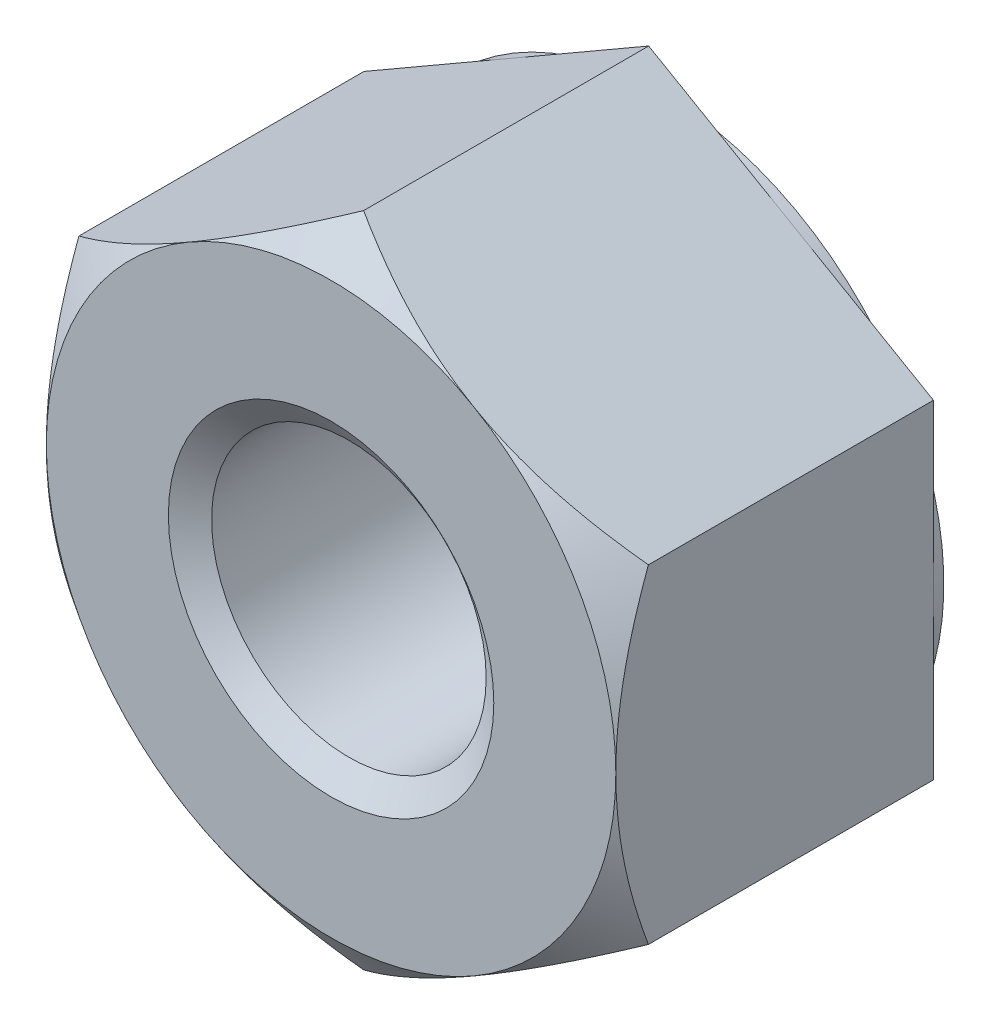
ISO-10303-21;
HEADER;
FILE_DESCRIPTION(('STEP AP214'),'2;1');
FILE_NAME('part.step','',(''),(''),'','','');
FILE_SCHEMA(('AUTOMOTIVE_DESIGN { 1 0 10303 214 1 1 1 1 }'));
ENDSEC;
DATA;
#1=APPLICATION_CONTEXT('core data for automotive mechanical design processes');
#2=APPLICATION_PROTOCOL_DEFINITION('international standard','automotive_design',2000,#1);
#3=PRODUCT_CONTEXT('',#1,'mechanical');
#4=PRODUCT('Part','Part','',(#3));
#5=PRODUCT_RELATED_PRODUCT_CATEGORY('part','',(#4));
#6=PRODUCT_DEFINITION_FORMATION('','',#4);
#7=PRODUCT_DEFINITION_CONTEXT('part definition',#1,'design');
#8=PRODUCT_DEFINITION('design','',#6,#7);
#9=PRODUCT_DEFINITION_SHAPE('','',#8);
#10=(LENGTH_UNIT() NAMED_UNIT(*) SI_UNIT(.MILLI.,.METRE.));
#11=(NAMED_UNIT(*) PLANE_ANGLE_UNIT() SI_UNIT($,.RADIAN.));
#12=(NAMED_UNIT(*) SI_UNIT($,.STERADIAN.) SOLID_ANGLE_UNIT());
#13=UNCERTAINTY_MEASURE_WITH_UNIT(LENGTH_MEASURE(1.E-05),#10,'distance_accuracy_value','');
#14=(GEOMETRIC_REPRESENTATION_CONTEXT(3) GLOBAL_UNCERTAINTY_ASSIGNED_CONTEXT((#13)) GLOBAL_UNIT_ASSIGNED_CONTEXT((#10,
#11,#12)) REPRESENTATION_CONTEXT('',''));
#15=CARTESIAN_POINT('',(0.,0.,0.));
#16=DIRECTION('',(0.,0.,1.));
#17=DIRECTION('',(1.,0.,0.));
#18=AXIS2_PLACEMENT_3D('',#15,#16,#17);
#19=CARTESIAN_POINT('',(0.,0.,-12.8015999999998));
#20=DIRECTION('',(0.,0.,1.));
#21=DIRECTION('',(1.,0.,0.));
#22=AXIS2_PLACEMENT_3D('',#19,#20,#21);
#23=CYLINDRICAL_SURFACE('',#22,5.35813);
#24=CARTESIAN_POINT('',(0.,0.,-0.694514850924061));
#25=DIRECTION('',(0.,0.,1.));
#26=DIRECTION('',(1.,0.,0.));
#27=AXIS2_PLACEMENT_3D('',#24,#25,#26);
#28=CIRCLE('',#27,5.35813);
#29=CARTESIAN_POINT('',(5.35813000000004,0.,-0.694514850924061));
#30=VERTEX_POINT('',#29);
#31=EDGE_CURVE('E153',#30,#30,#28,.F.);
#32=ORIENTED_EDGE('',*,*,#31,.F.);
#33=EDGE_LOOP('',(#32));
#34=FACE_BOUND('',#33,.T.);
#35=CARTESIAN_POINT('',(0.,0.,-12.0816851490758));
#36=DIRECTION('',(0.,0.,-1.));
#37=DIRECTION('',(-1.,0.,0.));
#38=AXIS2_PLACEMENT_3D('',#35,#36,#37);
#39=CIRCLE('',#38,5.35813);
#40=CARTESIAN_POINT('',(-5.35812999999998,0.,-12.0816851490758));
#41=VERTEX_POINT('',#40);
#42=EDGE_CURVE('E41',#41,#41,#39,.F.);
#43=ORIENTED_EDGE('',*,*,#42,.F.);
#44=EDGE_LOOP('',(#43));
#45=FACE_BOUND('',#44,.T.);
#46=ADVANCED_FACE('F36',(#34,#45),#23,.F.);
#47=CARTESIAN_POINT('',(0.,12.8316097327397,-12.8015999999998));
#48=DIRECTION('',(0.,0.,-1.));
#49=DIRECTION('',(-1.,0.,0.));
#50=AXIS2_PLACEMENT_3D('',#47,#48,#49);
#51=PLANE('',#50);
#52=CARTESIAN_POINT('',(0.,0.,-12.8015999999998));
#53=DIRECTION('',(0.,0.,-1.));
#54=DIRECTION('',(-1.,0.,0.));
#55=AXIS2_PLACEMENT_3D('',#52,#53,#54);
#56=CIRCLE('',#55,11.1125);
#57=CARTESIAN_POINT('',(-11.1125,0.,-12.8015999999998));
#58=VERTEX_POINT('',#57);
#59=EDGE_CURVE('E286',#58,#58,#56,.F.);
#60=ORIENTED_EDGE('',*,*,#59,.F.);
#61=EDGE_LOOP('',(#60));
#62=FACE_BOUND('',#61,.T.);
#63=CARTESIAN_POINT('',(0.,0.,-12.8015999999998));
#64=DIRECTION('',(0.,0.,-1.));
#65=DIRECTION('',(-1.,0.,0.));
#66=AXIS2_PLACEMENT_3D('',#63,#64,#65);
#67=CIRCLE('',#66,6.35);
#68=CARTESIAN_POINT('',(-6.34999999999998,0.,-12.8015999999998));
#69=VERTEX_POINT('',#68);
#70=EDGE_CURVE('E306',#69,#69,#67,.F.);
#71=ORIENTED_EDGE('',*,*,#70,.T.);
#72=EDGE_LOOP('',(#71));
#73=FACE_BOUND('',#72,.T.);
#74=ADVANCED_FACE('F237',(#62,#73),#51,.T.);
#75=CARTESIAN_POINT('',(0.,12.8316097327396,0.));
#76=DIRECTION('',(0.,0.,-1.));
#77=DIRECTION('',(-1.,0.,0.));
#78=AXIS2_PLACEMENT_3D('',#75,#76,#77);
#79=PLANE('',#78);
#80=CARTESIAN_POINT('',(0.,0.,0.));
#81=DIRECTION('',(0.,0.,-1.));
#82=DIRECTION('',(-1.,0.,0.));
#83=AXIS2_PLACEMENT_3D('',#80,#81,#82);
#84=CIRCLE('',#83,11.1125);
#85=CARTESIAN_POINT('',(-5.55625000000004,9.62370729955453,0.));
#86=VERTEX_POINT('',#85);
#87=CARTESIAN_POINT('',(-11.1125,0.,0.));
#88=VERTEX_POINT('',#87);
#89=EDGE_CURVE('E48',#86,#88,#84,.F.);
#90=ORIENTED_EDGE('',*,*,#89,.T.);
#91=CARTESIAN_POINT('',(-5.55624999999993,-9.62370729955431,0.));
#92=VERTEX_POINT('',#91);
#93=EDGE_CURVE('E11',#88,#92,#84,.F.);
#94=ORIENTED_EDGE('',*,*,#93,.T.);
#95=CARTESIAN_POINT('',(5.5562500000001,-9.62370729955431,0.));
#96=VERTEX_POINT('',#95);
#97=EDGE_CURVE('E46',#92,#96,#84,.F.);
#98=ORIENTED_EDGE('',*,*,#97,.T.);
#99=CARTESIAN_POINT('',(11.1125,0.,0.));
#100=VERTEX_POINT('',#99);
#101=EDGE_CURVE('E132',#96,#100,#84,.F.);
#102=ORIENTED_EDGE('',*,*,#101,.T.);
#103=CARTESIAN_POINT('',(0.,0.,0.));
#104=DIRECTION('',(0.,0.,1.));
#105=DIRECTION('',(1.,0.,0.));
#106=AXIS2_PLACEMENT_3D('',#103,#104,#105);
#107=CIRCLE('',#106,11.1125);
#108=CARTESIAN_POINT('',(5.55625000000004,9.62370729955475,0.));
#109=VERTEX_POINT('',#108);
#110=EDGE_CURVE('E144',#100,#109,#107,.T.);
#111=ORIENTED_EDGE('',*,*,#110,.T.);
#112=EDGE_CURVE('E159',#109,#86,#84,.F.);
#113=ORIENTED_EDGE('',*,*,#112,.T.);
#114=EDGE_LOOP('',(#90,#94,#98,#102,#111,#113));
#115=FACE_BOUND('',#114,.T.);
#116=CARTESIAN_POINT('',(0.,0.,0.));
#117=DIRECTION('',(0.,0.,1.));
#118=DIRECTION('',(1.,0.,0.));
#119=AXIS2_PLACEMENT_3D('',#116,#117,#118);
#120=CIRCLE('',#119,6.35);
#121=CARTESIAN_POINT('',(6.35000000000001,0.,0.));
#122=VERTEX_POINT('',#121);
#123=EDGE_CURVE('E305',#122,#122,#120,.T.);
#124=ORIENTED_EDGE('',*,*,#123,.F.);
#125=EDGE_LOOP('',(#124));
#126=FACE_BOUND('',#125,.T.);
#127=ADVANCED_FACE('F156',(#115,#126),#79,.F.);
#128=CARTESIAN_POINT('',(0.,12.8316097327397,-12.8015999999998));
#129=DIRECTION('',(-0.500000000000004,0.866025403784435,0.));
#130=DIRECTION('',(-0.866025403784438,-0.500000000000003,0.));
#131=AXIS2_PLACEMENT_3D('',#128,#129,#130);
#132=PLANE('',#131);
#133=DIRECTION('',(0.,0.,1.));
#134=VECTOR('',#133,1.);
#135=CARTESIAN_POINT('',(-11.1125,6.41580486636983,-12.8015999999998));
#136=LINE('',#135,#134);
#137=CARTESIAN_POINT('',(-11.1125,6.41580486636983,-12.3951999999998));
#138=VERTEX_POINT('',#137);
#139=CARTESIAN_POINT('',(-11.1125,6.41580486636983,-1.26999999999997));
#140=VERTEX_POINT('',#139);
#141=EDGE_CURVE('E295',#138,#140,#136,.T.);
#142=ORIENTED_EDGE('',*,*,#141,.T.);
#143=CARTESIAN_POINT('',(-11.1126999999999,6.41568939631609,-1.27008530516985));
#144=CARTESIAN_POINT('',(-10.9046050217331,6.53583308803543,-1.18134064166522));
#145=CARTESIAN_POINT('',(-10.6954772834328,6.65657304403813,-1.09586782205697));
#146=CARTESIAN_POINT('',(-10.2749903122984,6.89934131001325,-0.932344926303445));
#147=CARTESIAN_POINT('',(-10.0636304244401,7.02136999816417,-0.854297100283585));
#148=CARTESIAN_POINT('',(-9.42495272948811,7.39011073727011,-0.632274628545997));
#149=CARTESIAN_POINT('',(-8.99420163612717,7.63880499697578,-0.50092849123043));
#150=CARTESIAN_POINT('',(-8.34427916063396,8.01403791315417,-0.33576222545285));
#151=CARTESIAN_POINT('',(-8.12805793226459,8.13887329755774,-0.286179464248843));
#152=CARTESIAN_POINT('',(-7.69392340074743,8.38952098619368,-0.198164990498154));
#153=CARTESIAN_POINT('',(-7.47601029755032,8.51533317498449,-0.159731980234606));
#154=CARTESIAN_POINT('',(-7.03909732641912,8.76758499647953,-0.0948553392473009));
#155=CARTESIAN_POINT('',(-6.82009898678598,8.89402374681879,-0.0683980440877462));
#156=CARTESIAN_POINT('',(-6.38123329123673,9.14740297428227,-0.0280072960101117));
#157=CARTESIAN_POINT('',(-6.16136594364544,9.27434344660013,-0.014073723409276));
#158=CARTESIAN_POINT('',(-5.71833458147632,9.53012772280792,0.00103586915825363));
#159=CARTESIAN_POINT('',(-5.49516605890452,9.65897412938938,0.00203749087041886));
#160=CARTESIAN_POINT('',(-5.04907985776151,9.91652211770106,-0.00919163386511362));
#161=CARTESIAN_POINT('',(-4.82616218122504,10.0452236982565,-0.0214224868849219));
#162=CARTESIAN_POINT('',(-4.38101856288731,10.3022274861319,-0.0588270542078527));
#163=CARTESIAN_POINT('',(-4.15879308610284,10.4305294249742,-0.0840081187490128));
#164=CARTESIAN_POINT('',(-3.71567115677472,10.6863659901556,-0.14671420826064));
#165=CARTESIAN_POINT('',(-3.49477470827424,10.8139006141604,-0.18423927076463));
#166=CARTESIAN_POINT('',(-2.83488587569886,11.194887609283,-0.314109547357676));
#167=CARTESIAN_POINT('',(-2.39840611702616,11.4468893154485,-0.423775856418615));
#168=CARTESIAN_POINT('',(-1.53434564369014,11.9457548623252,-0.681346289503878));
#169=CARTESIAN_POINT('',(-1.10676241836065,12.1926201525701,-0.829239463043655));
#170=CARTESIAN_POINT('',(-0.568966142172578,12.5031169773965,-1.03647212292548));
#171=CARTESIAN_POINT('',(-0.454577641619691,12.5691592089829,-1.0817906196289));
#172=CARTESIAN_POINT('',(-0.226625025728709,12.70076771313,-1.17444447711563));
#173=CARTESIAN_POINT('',(-0.113059867354047,12.7663345878882,-1.22177641459556));
#174=CARTESIAN_POINT('',(0.000200000000102896,12.8317252027934,-1.27008530516988));
#175=B_SPLINE_CURVE_WITH_KNOTS('',3,(#143,#144,#145,#146,#147,#148,#149,#150,#151,#152,#153,
#154,#155,#156,#157,#158,#159,#160,#161,#162,#163,#164,#165,#166,#167,#168,#169,#170,#171,#172,
#173,#174),.UNSPECIFIED.,.F.,.F.,(4,2,2,2,2,2,2,2,2,2,2,2,2,2,2,4),(0.,0.768386325521689,
1.53700477170945,3.07854684793226,3.8419855279067,4.60533531575301,5.36781190300428,
6.13028120358267,6.90302246936954,7.67576995873002,8.44895652638185,9.22214544502923,
10.7675269565734,12.312466267119,12.7313864194721,13.1496207504345),.UNSPECIFIED.);
#176=EDGE_CURVE('E60',#140,#86,#175,.T.);
#177=ORIENTED_EDGE('',*,*,#176,.T.);
#178=CARTESIAN_POINT('',(0.,12.8316097327397,-1.26999999999998));
#179=VERTEX_POINT('',#178);
#180=EDGE_CURVE('E168',#86,#179,#175,.T.);
#181=ORIENTED_EDGE('',*,*,#180,.T.);
#182=DIRECTION('',(0.,0.,1.));
#183=VECTOR('',#182,1.);
#184=CARTESIAN_POINT('',(0.,12.8316097327397,-12.8015999999998));
#185=LINE('',#184,#183);
#186=CARTESIAN_POINT('',(0.,12.8316097327397,-12.3951999999998));
#187=VERTEX_POINT('',#186);
#188=EDGE_CURVE('E283',#187,#179,#185,.T.);
#189=ORIENTED_EDGE('',*,*,#188,.F.);
#190=DIRECTION('',(-0.866025403784438,-0.500000000000003,0.));
#191=VECTOR('',#190,1.);
#192=CARTESIAN_POINT('',(0.,12.8316097327397,-12.3951999999998));
#193=LINE('',#192,#191);
#194=CARTESIAN_POINT('',(-5.55625,9.62370729955453,-12.3951999999998));
#195=VERTEX_POINT('',#194);
#196=EDGE_CURVE('E271',#187,#195,#193,.T.);
#197=ORIENTED_EDGE('',*,*,#196,.T.);
#198=EDGE_CURVE('E267',#195,#138,#193,.T.);
#199=ORIENTED_EDGE('',*,*,#198,.T.);
#200=EDGE_LOOP('',(#142,#177,#181,#189,#197,#199));
#201=FACE_BOUND('',#200,.T.);
#202=ADVANCED_FACE('F38',(#201),#132,.T.);
#203=CARTESIAN_POINT('',(11.1125000000001,6.41580486636983,-12.8015999999998));
#204=DIRECTION('',(0.500000000000002,0.866025403784437,0.));
#205=DIRECTION('',(-0.866025403784439,0.5,0.));
#206=AXIS2_PLACEMENT_3D('',#203,#204,#205);
#207=PLANE('',#206);
#208=ORIENTED_EDGE('',*,*,#188,.T.);
#209=CARTESIAN_POINT('',(-0.000199999999964118,12.8317252027936,-1.27008530516988));
#210=CARTESIAN_POINT('',(0.207894978266814,12.7115815110742,-1.18134064166532));
#211=CARTESIAN_POINT('',(0.41702271656712,12.5908415550714,-1.09586782205709));
#212=CARTESIAN_POINT('',(0.837509687701428,12.3480732890963,-0.932344926303585));
#213=CARTESIAN_POINT('',(1.04886957555978,12.2260446009454,-0.854297100283715));
#214=CARTESIAN_POINT('',(1.68754727051176,11.8573038618394,-0.632274628546102));
#215=CARTESIAN_POINT('',(2.11829836387271,11.6086096021338,-0.500928491230531));
#216=CARTESIAN_POINT('',(2.76822083936592,11.2333766859554,-0.335762225452934));
#217=CARTESIAN_POINT('',(2.9844420677353,11.1085413015518,-0.28617946424892));
#218=CARTESIAN_POINT('',(3.41857659925247,10.8578936129158,-0.198164990498214));
#219=CARTESIAN_POINT('',(3.63648970244959,10.732081424125,-0.159731980234658));
#220=CARTESIAN_POINT('',(4.0734026735808,10.47982960263,-0.0948553392473506));
#221=CARTESIAN_POINT('',(4.29240101321393,10.3533908522907,-0.0683980440878032));
#222=CARTESIAN_POINT('',(4.73126670876323,10.1000116248273,-0.0280072960101188));
#223=CARTESIAN_POINT('',(4.95113405635457,9.97307115250949,-0.0140737234092258));
#224=CARTESIAN_POINT('',(5.3941654185237,9.71728687630169,0.00103586915831454));
#225=CARTESIAN_POINT('',(5.61733394109545,9.58844046972015,0.00203749087043197));
#226=CARTESIAN_POINT('',(6.06342014223844,9.33089248140841,-0.00919163386512802));
#227=CARTESIAN_POINT('',(6.28633781877492,9.20219090085296,-0.021422486884916));
#228=CARTESIAN_POINT('',(6.73148143711268,8.94518711297763,-0.0588270542078275));
#229=CARTESIAN_POINT('',(6.95370691389715,8.81688517413531,-0.0840081187489886));
#230=CARTESIAN_POINT('',(7.39682884322528,8.56104860895389,-0.146714208260613));
#231=CARTESIAN_POINT('',(7.61772529172577,8.43351398494911,-0.1842392707646));
#232=CARTESIAN_POINT('',(8.27761412430116,8.05252698982645,-0.314109547357635));
#233=CARTESIAN_POINT('',(8.71409388297383,7.80052528366085,-0.423775856418566));
#234=CARTESIAN_POINT('',(9.57815435630996,7.30165973678437,-0.681346289503831));
#235=CARTESIAN_POINT('',(10.0057375816396,7.05479444653971,-0.829239463043617));
#236=CARTESIAN_POINT('',(10.5435338578275,6.74429762171309,-1.03647212292542));
#237=CARTESIAN_POINT('',(10.6579223583804,6.6782553901266,-1.08179061962881));
#238=CARTESIAN_POINT('',(10.8858749742713,6.5466468859794,-1.17444447711555));
#239=CARTESIAN_POINT('',(10.9994401326459,6.48108001122124,-1.2217764145955));
#240=CARTESIAN_POINT('',(11.1127,6.41568939631609,-1.27008530516987));
#241=B_SPLINE_CURVE_WITH_KNOTS('',3,(#209,#210,#211,#212,#213,#214,#215,#216,#217,#218,#219,
#220,#221,#222,#223,#224,#225,#226,#227,#228,#229,#230,#231,#232,#233,#234,#235,#236,#237,#238,
#239,#240),.UNSPECIFIED.,.F.,.F.,(4,2,2,2,2,2,2,2,2,2,2,2,2,2,2,4),(0.,0.768386325521684,
1.53700477170944,3.07854684793226,3.84198552790672,4.60533531575306,5.36781190300435,
6.13028120358276,6.90302246936964,7.67576995873014,8.44895652638199,9.22214544502938,
10.7675269565735,12.3124662671192,12.7313864194722,13.1496207504346),.UNSPECIFIED.);
#242=EDGE_CURVE('E165',#179,#109,#241,.T.);
#243=ORIENTED_EDGE('',*,*,#242,.T.);
#244=CARTESIAN_POINT('',(11.1125000000001,6.41580486636983,-1.26999999999998));
#245=VERTEX_POINT('',#244);
#246=EDGE_CURVE('E147',#109,#245,#241,.T.);
#247=ORIENTED_EDGE('',*,*,#246,.T.);
#248=DIRECTION('',(0.,0.,1.));
#249=VECTOR('',#248,1.);
#250=CARTESIAN_POINT('',(11.1125000000001,6.41580486636983,-12.8015999999998));
#251=LINE('',#250,#249);
#252=CARTESIAN_POINT('',(11.1125000000001,6.41580486636983,-12.3951999999998));
#253=VERTEX_POINT('',#252);
#254=EDGE_CURVE('E164',#253,#245,#251,.T.);
#255=ORIENTED_EDGE('',*,*,#254,.F.);
#256=DIRECTION('',(-0.866025403784439,0.5,0.));
#257=VECTOR('',#256,1.);
#258=CARTESIAN_POINT('',(11.1125000000001,6.41580486636983,-12.3951999999998));
#259=LINE('',#258,#257);
#260=CARTESIAN_POINT('',(5.55625000000007,9.62370729955475,-12.3951999999998));
#261=VERTEX_POINT('',#260);
#262=EDGE_CURVE('E279',#253,#261,#259,.T.);
#263=ORIENTED_EDGE('',*,*,#262,.T.);
#264=EDGE_CURVE('E275',#261,#187,#259,.T.);
#265=ORIENTED_EDGE('',*,*,#264,.T.);
#266=EDGE_LOOP('',(#208,#243,#247,#255,#263,#265));
#267=FACE_BOUND('',#266,.T.);
#268=ADVANCED_FACE('F250',(#267),#207,.T.);
#269=CARTESIAN_POINT('',(11.1125000000001,6.41580486636983,-12.8015999999998));
#270=DIRECTION('',(-1.,0.,0.));
#271=DIRECTION('',(0.,0.,1.));
#272=AXIS2_PLACEMENT_3D('',#269,#270,#271);
#273=PLANE('',#272);
#274=CARTESIAN_POINT('',(11.1125000000001,-15.246710890886,-5.72840058315631));
#275=CARTESIAN_POINT('',(11.1125000000001,-15.0441602090092,-5.60747800479094));
#276=CARTESIAN_POINT('',(11.1125000000001,-14.8412439144407,-5.48716820994976));
#277=CARTESIAN_POINT('',(11.1125000000001,-14.434611363217,-5.24790203622143));
#278=CARTESIAN_POINT('',(11.1125000000001,-14.230895095532,-5.12894567608384));
#279=CARTESIAN_POINT('',(11.1125000000001,-13.618374367904,-4.77425877406688));
#280=CARTESIAN_POINT('',(11.1125000000001,-13.2082746085762,-4.54075628375203));
#281=CARTESIAN_POINT('',(11.1125000000001,-12.3813241122369,-4.07949661513829));
#282=CARTESIAN_POINT('',(11.1125000000001,-11.9644467571166,-3.85178704509118));
#283=CARTESIAN_POINT('',(11.1125000000001,-11.1258727907321,-3.40544966601054));
#284=CARTESIAN_POINT('',(11.1125000000001,-10.7041764579801,-3.18682133547902));
#285=CARTESIAN_POINT('',(11.1125000000001,-9.83635545297431,-2.75146666673949));
#286=CARTESIAN_POINT('',(11.1125000000001,-9.38997383278726,-2.53524976622283));
#287=CARTESIAN_POINT('',(11.1125000000001,-8.48986095993878,-2.1184306428736));
#288=CARTESIAN_POINT('',(11.1125000000001,-8.03612875658917,-1.91783045962557));
#289=CARTESIAN_POINT('',(11.1125000000001,-7.12137381888848,-1.53708946517439));
#290=CARTESIAN_POINT('',(11.1125,-6.66037155619668,-1.35689996547427));
#291=CARTESIAN_POINT('',(11.1125000000001,-5.72931137053916,-1.02198876643956));
#292=CARTESIAN_POINT('',(11.1125000000001,-5.25925684083886,-0.867257723801456));
#293=CARTESIAN_POINT('',(11.1125000000001,-4.29229238491479,-0.584797921379117));
#294=CARTESIAN_POINT('',(11.1125000000001,-3.79502698978564,-0.458253210106627));
#295=CARTESIAN_POINT('',(11.1125000000001,-3.04249063272646,-0.300274889971808));
#296=CARTESIAN_POINT('',(11.1125000000001,-2.79051831675878,-0.252919385506828));
#297=CARTESIAN_POINT('',(11.1125000000001,-2.28469146382747,-0.169731945132974));
#298=CARTESIAN_POINT('',(11.1125000000001,-2.03083719621041,-0.133898391565902));
#299=CARTESIAN_POINT('',(11.1125000000001,-1.52591319796808,-0.0750217031057025));
#300=CARTESIAN_POINT('',(11.1125000000001,-1.27486715228221,-0.051776211685105));
#301=CARTESIAN_POINT('',(11.1125000000001,-0.771928527158923,-0.0177037232150421));
#302=CARTESIAN_POINT('',(11.1125000000001,-0.520035953806629,-0.00687663708846453));
#303=CARTESIAN_POINT('',(11.1125000000001,-0.0160179866655524,0.00210154015671596));
#304=CARTESIAN_POINT('',(11.1125000000001,0.236107412369321,0.000252338319343403));
#305=CARTESIAN_POINT('',(11.1125000000001,0.73994390115569,-0.0160780920710702));
#306=CARTESIAN_POINT('',(11.1125000000001,0.991654995175578,-0.030559189657036));
#307=CARTESIAN_POINT('',(11.1125000000001,1.47359432786587,-0.0701318803670082));
#308=CARTESIAN_POINT('',(11.1125000000001,1.70390216450626,-0.0942629780048131));
#309=CARTESIAN_POINT('',(11.1125000000001,2.16327081747014,-0.152434691178106));
#310=CARTESIAN_POINT('',(11.1125000000001,2.3923314860953,-0.186476455473737));
#311=CARTESIAN_POINT('',(11.1125000000001,3.07709105536354,-0.302601153154235));
#312=CARTESIAN_POINT('',(11.1125000000001,3.53048093936109,-0.398693308089063));
#313=CARTESIAN_POINT('',(11.1125000000001,4.20885304554304,-0.567647410129398));
#314=CARTESIAN_POINT('',(11.1125000000001,4.43688270669131,-0.628816028844718));
#315=CARTESIAN_POINT('',(11.1125000000001,4.89083035320096,-0.758599300407729));
#316=CARTESIAN_POINT('',(11.1125000000001,5.11674831627183,-0.82721403175839));
#317=CARTESIAN_POINT('',(11.1125000000001,5.56639162129324,-0.971121407153329));
#318=CARTESIAN_POINT('',(11.1125,5.79011733541765,-1.04641289509514));
#319=CARTESIAN_POINT('',(11.1125000000001,6.2354454226757,-1.2029758425451));
#320=CARTESIAN_POINT('',(11.1125000000001,6.45704790342329,-1.28424699714835));
#321=CARTESIAN_POINT('',(11.1125000000001,7.16832587425331,-1.5548841955894));
#322=CARTESIAN_POINT('',(11.1125000000001,7.65401594562538,-1.75476437431638));
#323=CARTESIAN_POINT('',(11.1125,8.61658911069009,-2.17482189444202));
#324=CARTESIAN_POINT('',(11.1125,9.09346942364432,-2.3950055173915));
#325=CARTESIAN_POINT('',(11.1125000000001,10.0401660951479,-2.85129752815416));
#326=CARTESIAN_POINT('',(11.1125000000001,10.509973991913,-3.08742338429941));
#327=CARTESIAN_POINT('',(11.1125000000001,11.4431520642536,-3.57188970171147));
#328=CARTESIAN_POINT('',(11.1125000000001,11.9065229062198,-3.82022888633489));
#329=CARTESIAN_POINT('',(11.1125000000001,12.8302935002076,-4.32785175515355));
#330=CARTESIAN_POINT('',(11.1125000000001,13.2906660205763,-4.58718482629131));
#331=CARTESIAN_POINT('',(11.1125000000001,14.2069402202837,-5.11363245060381));
#332=CARTESIAN_POINT('',(11.1125000000001,14.6628418062128,-5.38074716589642));
#333=CARTESIAN_POINT('',(11.1125000000001,15.5706282906487,-5.92109092127698));
#334=CARTESIAN_POINT('',(11.1125000000001,16.0225154395703,-6.19431618821108));
#335=CARTESIAN_POINT('',(11.1125000000001,16.9231402489315,-6.74589089301528));
#336=CARTESIAN_POINT('',(11.1125000000001,17.3718779370931,-7.02424028570381));
#337=CARTESIAN_POINT('',(11.1125000000001,18.6108979717235,-7.80090274256805));
#338=CARTESIAN_POINT('',(11.1125000000001,19.3983654046087,-8.30370510756173));
#339=CARTESIAN_POINT('',(11.1125000000001,20.9671943628346,-9.31898330610803));
#340=CARTESIAN_POINT('',(11.1125000000001,21.7485548869179,-9.8314606807569));
#341=CARTESIAN_POINT('',(11.1125000000001,23.2983507755522,-10.858251144613));
#342=CARTESIAN_POINT('',(11.1125000000001,24.0668359112124,-11.3724891964555));
#343=CARTESIAN_POINT('',(11.1125,25.2167154656766,-12.1478819893803));
#344=CARTESIAN_POINT('',(11.1125,25.5994927584368,-12.4069906614899));
#345=CARTESIAN_POINT('',(11.1125000000001,26.3642202956771,-12.9264221444854));
#346=CARTESIAN_POINT('',(11.1125000000001,26.7461705438098,-13.186744949993));
#347=CARTESIAN_POINT('',(11.1125000000001,27.1277561313594,-13.4476014090156));
#348=B_SPLINE_CURVE_WITH_KNOTS('',3,(#274,#275,#276,#277,#278,#279,#280,#281,#282,#283,#284,
#285,#286,#287,#288,#289,#290,#291,#292,#293,#294,#295,#296,#297,#298,#299,#300,#301,#302,#303,
#304,#305,#306,#307,#308,#309,#310,#311,#312,#313,#314,#315,#316,#317,#318,#319,#320,#321,#322,
#323,#324,#325,#326,#327,#328,#329,#330,#331,#332,#333,#334,#335,#336,#337,#338,#339,#340,#341,
#342,#343,#344,#345,#346,#347),.UNSPECIFIED.,.F.,.F.,(4,2,2,2,2,2,2,2,2,2,2,2,2,2,2,2,2,2,2,2,2,
2,2,2,2,2,2,2,2,2,2,2,2,2,2,2,4),(0.,0.707699525444878,1.41540884297019,2.83109537629538,
4.25604800140787,5.68091868394156,7.16865099538788,8.65657728377074,10.1408759403347,
11.6246286354124,13.1622407033492,13.9311701543542,14.6999916020605,15.4560565867186,
16.2121161480952,16.9681931824824,17.7242623779811,18.4187379887785,19.11329412935,
20.5020659331084,21.2102533479618,21.9184482298277,22.6265207239593,23.3345571382622,
24.9095068003753,26.4849453713336,28.0621391228456,29.6391683612951,31.2242459421906,
32.8093565692434,34.393514061421,35.9776575921021,38.7804471562769,41.5836869974576,
44.3576574928493,45.7443431444904,47.1310226593793),.UNSPECIFIED.);
#349=CARTESIAN_POINT('',(11.1125000000001,-6.4158048663695,-1.26999999999998));
#350=VERTEX_POINT('',#349);
#351=EDGE_CURVE('E128',#350,#100,#348,.T.);
#352=ORIENTED_EDGE('',*,*,#351,.F.);
#353=DIRECTION('',(0.,0.,1.));
#354=VECTOR('',#353,1.);
#355=CARTESIAN_POINT('',(11.1125000000001,-6.41580486636939,-12.8015999999998));
#356=LINE('',#355,#354);
#357=CARTESIAN_POINT('',(11.1125000000001,-6.41580486636939,-12.3951999999998));
#358=VERTEX_POINT('',#357);
#359=EDGE_CURVE('E288',#358,#350,#356,.T.);
#360=ORIENTED_EDGE('',*,*,#359,.F.);
#361=DIRECTION('',(0.,-0.999999999999998,0.));
#362=VECTOR('',#361,1.);
#363=CARTESIAN_POINT('',(11.1125000000001,6.41580486636983,-12.3951999999998));
#364=LINE('',#363,#362);
#365=CARTESIAN_POINT('',(11.1125,2.22044604925031E-13,-12.3951999999998));
#366=VERTEX_POINT('',#365);
#367=EDGE_CURVE('E280',#366,#358,#364,.T.);
#368=ORIENTED_EDGE('',*,*,#367,.F.);
#369=EDGE_CURVE('E282',#253,#366,#364,.T.);
#370=ORIENTED_EDGE('',*,*,#369,.F.);
#371=ORIENTED_EDGE('',*,*,#254,.T.);
#372=EDGE_CURVE('E141',#100,#245,#348,.T.);
#373=ORIENTED_EDGE('',*,*,#372,.F.);
#374=EDGE_LOOP('',(#352,#360,#368,#370,#371,#373));
#375=FACE_BOUND('',#374,.T.);
#376=ADVANCED_FACE('F161',(#375),#273,.F.);
#377=CARTESIAN_POINT('',(0.,-12.831609732739,-12.8015999999998));
#378=DIRECTION('',(0.500000000000004,-0.866025403784435,0.));
#379=DIRECTION('',(0.866025403784438,0.500000000000003,0.));
#380=AXIS2_PLACEMENT_3D('',#377,#378,#379);
#381=PLANE('',#380);
#382=ORIENTED_EDGE('',*,*,#359,.T.);
#383=CARTESIAN_POINT('',(11.1127,-6.41568939631543,-1.27008530516988));
#384=CARTESIAN_POINT('',(10.9046050217332,-6.53583308803475,-1.18134064166511));
#385=CARTESIAN_POINT('',(10.6954772834329,-6.65657304403746,-1.09586782205679));
#386=CARTESIAN_POINT('',(10.2749903122985,-6.8993413100126,-0.932344926303199));
#387=CARTESIAN_POINT('',(10.0636304244401,-7.02136999816353,-0.854297100283337));
#388=CARTESIAN_POINT('',(9.42495272948814,-7.39011073726948,-0.632274628545744));
#389=CARTESIAN_POINT('',(8.9942016361272,-7.63880499697515,-0.500928491230155));
#390=CARTESIAN_POINT('',(8.34427916063399,-8.01403791315354,-0.335762225452541));
#391=CARTESIAN_POINT('',(8.12805793226462,-8.1388732975571,-0.286179464248524));
#392=CARTESIAN_POINT('',(7.69392340074746,-8.38952098619307,-0.198164990497833));
#393=CARTESIAN_POINT('',(7.47601029755035,-8.51533317498389,-0.159731980234296));
#394=CARTESIAN_POINT('',(7.0390973264191,-8.7675849964789,-0.0948553392469236));
#395=CARTESIAN_POINT('',(6.82009898678592,-8.89402374681811,-0.0683980440872919));
#396=CARTESIAN_POINT('',(6.38123329123671,-9.14740297428178,-0.0280072960098332));
#397=CARTESIAN_POINT('',(6.16136594364552,-9.27434344659989,-0.0140737234092506));
#398=CARTESIAN_POINT('',(5.71833458147636,-9.53012772280771,0.00103586915828349));
#399=CARTESIAN_POINT('',(5.49516605890441,-9.65897412938894,0.00203749087071377));
#400=CARTESIAN_POINT('',(5.04907985776128,-9.91652211770047,-0.00919163386462441));
#401=CARTESIAN_POINT('',(4.82616218122484,-10.045223698256,-0.0214224868845031));
#402=CARTESIAN_POINT('',(4.38101856288714,-10.3022274861314,-0.0588270542074811));
#403=CARTESIAN_POINT('',(4.15879308610267,-10.4305294249737,-0.0840081187486168));
#404=CARTESIAN_POINT('',(3.71567115677457,-10.6863659901551,-0.146714208260238));
#405=CARTESIAN_POINT('',(3.4947747082741,-10.8139006141599,-0.184239270764247));
#406=CARTESIAN_POINT('',(2.83488587569871,-11.1948876092825,-0.31410954735723));
#407=CARTESIAN_POINT('',(2.39840611702594,-11.4468893154479,-0.423775856417967));
#408=CARTESIAN_POINT('',(1.53434564369015,-11.9457548623247,-0.681346289503702));
#409=CARTESIAN_POINT('',(1.10676241836097,-12.1926201525697,-0.829239463044156));
#410=CARTESIAN_POINT('',(0.56896614217257,-12.503116977396,-1.03647212292538));
#411=CARTESIAN_POINT('',(0.454577641619576,-12.5691592089824,-1.08179061962857));
#412=CARTESIAN_POINT('',(0.22662502572855,-12.7007677131295,-1.17444447711516));
#413=CARTESIAN_POINT('',(0.113059867353951,-12.7663345878877,-1.22177641459516));
#414=CARTESIAN_POINT('',(-0.000199999999922484,-12.8317252027931,-1.27008530516991));
#415=B_SPLINE_CURVE_WITH_KNOTS('',3,(#383,#384,#385,#386,#387,#388,#389,#390,#391,#392,#393,
#394,#395,#396,#397,#398,#399,#400,#401,#402,#403,#404,#405,#406,#407,#408,#409,#410,#411,#412,
#413,#414),.UNSPECIFIED.,.F.,.F.,(4,2,2,2,2,2,2,2,2,2,2,2,2,2,2,4),(0.,0.768386325521765,
1.53700477170961,3.07854684793242,3.84198552790687,4.60533531575321,5.36781190300454,
6.130281203583,6.90302246936993,7.67576995873044,8.44895652638222,9.22214544502958,
10.7675269565737,12.3124662671194,12.7313864194724,13.1496207504348),.UNSPECIFIED.);
#416=EDGE_CURVE('E135',#350,#96,#415,.T.);
#417=ORIENTED_EDGE('',*,*,#416,.T.);
#418=CARTESIAN_POINT('',(0.,-12.8316097327392,-1.26999999999997));
#419=VERTEX_POINT('',#418);
#420=EDGE_CURVE('E176',#96,#419,#415,.T.);
#421=ORIENTED_EDGE('',*,*,#420,.T.);
#422=DIRECTION('',(0.,0.,1.));
#423=VECTOR('',#422,1.);
#424=CARTESIAN_POINT('',(0.,-12.831609732739,-12.8015999999998));
#425=LINE('',#424,#423);
#426=CARTESIAN_POINT('',(0.,-12.831609732739,-12.3951999999998));
#427=VERTEX_POINT('',#426);
#428=EDGE_CURVE('E290',#427,#419,#425,.T.);
#429=ORIENTED_EDGE('',*,*,#428,.F.);
#430=DIRECTION('',(0.866025403784438,0.500000000000003,0.));
#431=VECTOR('',#430,1.);
#432=CARTESIAN_POINT('',(0.,-12.831609732739,-12.3951999999998));
#433=LINE('',#432,#431);
#434=CARTESIAN_POINT('',(5.55625000000015,-9.62370729955442,-12.3951999999998));
#435=VERTEX_POINT('',#434);
#436=EDGE_CURVE('E272',#427,#435,#433,.T.);
#437=ORIENTED_EDGE('',*,*,#436,.T.);
#438=EDGE_CURVE('E276',#435,#358,#433,.T.);
#439=ORIENTED_EDGE('',*,*,#438,.T.);
#440=EDGE_LOOP('',(#382,#417,#421,#429,#437,#439));
#441=FACE_BOUND('',#440,.T.);
#442=ADVANCED_FACE('F223',(#441),#381,.T.);
#443=CARTESIAN_POINT('',(-11.1125000000001,-6.41580486636972,-12.8015999999998));
#444=DIRECTION('',(-0.500000000000002,-0.866025403784437,0.));
#445=DIRECTION('',(0.866025403784439,-0.5,0.));
#446=AXIS2_PLACEMENT_3D('',#443,#444,#445);
#447=PLANE('',#446);
#448=ORIENTED_EDGE('',*,*,#428,.T.);
#449=CARTESIAN_POINT('',(0.000200000000102896,-12.8317252027931,-1.27008530516992));
#450=CARTESIAN_POINT('',(-0.207894978266798,-12.7115815110739,-1.18134064166526));
#451=CARTESIAN_POINT('',(-0.417022716567158,-12.5908415550712,-1.095867822057));
#452=CARTESIAN_POINT('',(-0.837509687701516,-12.3480732890961,-0.932344926303463));
#453=CARTESIAN_POINT('',(-1.04886957555986,-12.2260446009452,-0.854297100283601));
#454=CARTESIAN_POINT('',(-1.68754727051183,-11.8573038618393,-0.632274628546006));
#455=CARTESIAN_POINT('',(-2.11829836387278,-11.6086096021336,-0.500928491230431));
#456=CARTESIAN_POINT('',(-2.768220839366,-11.2333766859552,-0.335762225452834));
#457=CARTESIAN_POINT('',(-2.98444206773538,-11.1085413015516,-0.28617946424882));
#458=CARTESIAN_POINT('',(-3.41857659925254,-10.8578936129157,-0.198164990498124));
#459=CARTESIAN_POINT('',(-3.63648970244966,-10.7320814241249,-0.159731980234577));
#460=CARTESIAN_POINT('',(-4.0734026735809,-10.4798296026298,-0.0948553392472507));
#461=CARTESIAN_POINT('',(-4.29240101321406,-10.3533908522906,-0.0683980440876744));
#462=CARTESIAN_POINT('',(-4.73126670876329,-10.100011624827,-0.0280072960100797));
#463=CARTESIAN_POINT('',(-4.95113405635453,-9.97307115250905,-0.0140737234093054));
#464=CARTESIAN_POINT('',(-5.39416541852368,-9.71728687630124,0.00103586915822743));
#465=CARTESIAN_POINT('',(-5.61733394109554,-9.58844046971989,0.00203749087045925));
#466=CARTESIAN_POINT('',(-6.06342014223862,-9.33089248140828,-0.0091916338650226));
#467=CARTESIAN_POINT('',(-6.28633781877508,-9.20219090085279,-0.0214224868848468));
#468=CARTESIAN_POINT('',(-6.73148143711282,-8.94518711297742,-0.0588270542077894));
#469=CARTESIAN_POINT('',(-6.95370691389729,-8.81688517413512,-0.084008118748945));
#470=CARTESIAN_POINT('',(-7.39682884322542,-8.5610486089537,-0.146714208260572));
#471=CARTESIAN_POINT('',(-7.6177252917259,-8.4335139849489,-0.184239270764566));
#472=CARTESIAN_POINT('',(-8.27761412430132,-8.05252698982629,-0.314109547357602));
#473=CARTESIAN_POINT('',(-8.71409388297409,-7.80052528366086,-0.423775856418505));
#474=CARTESIAN_POINT('',(-9.57815435630996,-7.30165973678399,-0.681346289503866));
#475=CARTESIAN_POINT('',(-10.0057375816392,-7.05479444653876,-0.829239463043776));
#476=CARTESIAN_POINT('',(-10.5435338578275,-6.74429762171266,-1.03647212292547));
#477=CARTESIAN_POINT('',(-10.6579223583804,-6.67825539012636,-1.08179061962882));
#478=CARTESIAN_POINT('',(-10.8858749742714,-6.54664688597934,-1.17444447711551));
#479=CARTESIAN_POINT('',(-10.9994401326459,-6.48108001122118,-1.22177641459546));
#480=CARTESIAN_POINT('',(-11.1126999999999,-6.41568939631576,-1.27008530516988));
#481=B_SPLINE_CURVE_WITH_KNOTS('',3,(#449,#450,#451,#452,#453,#454,#455,#456,#457,#458,#459,
#460,#461,#462,#463,#464,#465,#466,#467,#468,#469,#470,#471,#472,#473,#474,#475,#476,#477,#478,
#479,#480),.UNSPECIFIED.,.F.,.F.,(4,2,2,2,2,2,2,2,2,2,2,2,2,2,2,4),(0.,0.768386325521705,
1.53700477170949,3.07854684793229,3.84198552790676,4.6053353157531,5.36781190300441,
6.13028120358284,6.90302246936974,7.67576995873025,8.44895652638209,9.22214544502948,
10.7675269565736,12.3124662671193,12.7313864194722,13.1496207504345),.UNSPECIFIED.);
#482=EDGE_CURVE('E217',#419,#92,#481,.T.);
#483=ORIENTED_EDGE('',*,*,#482,.T.);
#484=CARTESIAN_POINT('',(-11.1125000000001,-6.41580486636961,-1.26999999999997));
#485=VERTEX_POINT('',#484);
#486=EDGE_CURVE('E209',#92,#485,#481,.T.);
#487=ORIENTED_EDGE('',*,*,#486,.T.);
#488=DIRECTION('',(0.,0.,1.));
#489=VECTOR('',#488,1.);
#490=CARTESIAN_POINT('',(-11.1125000000001,-6.41580486636972,-12.8015999999998));
#491=LINE('',#490,#489);
#492=CARTESIAN_POINT('',(-11.1125000000001,-6.41580486636972,-12.3951999999998));
#493=VERTEX_POINT('',#492);
#494=EDGE_CURVE('E293',#493,#485,#491,.T.);
#495=ORIENTED_EDGE('',*,*,#494,.F.);
#496=DIRECTION('',(0.866025403784439,-0.5,0.));
#497=VECTOR('',#496,1.);
#498=CARTESIAN_POINT('',(-11.1125000000001,-6.41580486636972,-12.3951999999998));
#499=LINE('',#498,#497);
#500=CARTESIAN_POINT('',(-5.55625,-9.62370729955442,-12.3951999999998));
#501=VERTEX_POINT('',#500);
#502=EDGE_CURVE('E262',#493,#501,#499,.T.);
#503=ORIENTED_EDGE('',*,*,#502,.T.);
#504=EDGE_CURVE('E268',#501,#427,#499,.T.);
#505=ORIENTED_EDGE('',*,*,#504,.T.);
#506=EDGE_LOOP('',(#448,#483,#487,#495,#503,#505));
#507=FACE_BOUND('',#506,.T.);
#508=ADVANCED_FACE('F219',(#507),#447,.T.);
#509=CARTESIAN_POINT('',(-11.1125,6.41580486636983,-12.8015999999998));
#510=DIRECTION('',(-1.,0.,0.));
#511=DIRECTION('',(0.,0.,1.));
#512=AXIS2_PLACEMENT_3D('',#509,#510,#511);
#513=PLANE('',#512);
#514=ORIENTED_EDGE('',*,*,#494,.T.);
#515=CARTESIAN_POINT('',(-11.1125,-15.2467108908861,-5.72840058315634));
#516=CARTESIAN_POINT('',(-11.1125,-15.0441602090093,-5.60747800479097));
#517=CARTESIAN_POINT('',(-11.1125,-14.8412439144408,-5.48716820994979));
#518=CARTESIAN_POINT('',(-11.1125,-14.4346113632171,-5.24790203622146));
#519=CARTESIAN_POINT('',(-11.1125,-14.230895095532,-5.12894567608387));
#520=CARTESIAN_POINT('',(-11.1125,-13.6183743679041,-4.77425877406689));
#521=CARTESIAN_POINT('',(-11.1125,-13.2082746085763,-4.54075628375204));
#522=CARTESIAN_POINT('',(-11.1125,-12.381324112237,-4.07949661513829));
#523=CARTESIAN_POINT('',(-11.1125,-11.9644467571167,-3.85178704509117));
#524=CARTESIAN_POINT('',(-11.1125,-11.1258727907322,-3.40544966601052));
#525=CARTESIAN_POINT('',(-11.1125,-10.7041764579801,-3.18682133547901));
#526=CARTESIAN_POINT('',(-11.1125,-9.83635545297433,-2.75146666673948));
#527=CARTESIAN_POINT('',(-11.1125,-9.38997383278727,-2.5352497662228));
#528=CARTESIAN_POINT('',(-11.1125,-8.48986095993878,-2.11843064287357));
#529=CARTESIAN_POINT('',(-11.1125,-8.03612875658916,-1.91783045962554));
#530=CARTESIAN_POINT('',(-11.1125,-7.12137381888846,-1.53708946517435));
#531=CARTESIAN_POINT('',(-11.1125,-6.66037155619666,-1.3568999654742));
#532=CARTESIAN_POINT('',(-11.1125,-5.7293113705391,-1.02198876643954));
#533=CARTESIAN_POINT('',(-11.1124999999999,-5.25925684083877,-0.867257723801516));
#534=CARTESIAN_POINT('',(-11.1124999999999,-4.29229238491468,-0.584797921379174));
#535=CARTESIAN_POINT('',(-11.1125,-3.79502698978556,-0.458253210106597));
#536=CARTESIAN_POINT('',(-11.1125,-3.0424906327264,-0.300274889971753));
#537=CARTESIAN_POINT('',(-11.1125,-2.79051831675872,-0.252919385506783));
#538=CARTESIAN_POINT('',(-11.1125,-2.28469146382742,-0.169731945132938));
#539=CARTESIAN_POINT('',(-11.1125,-2.03083719621036,-0.133898391565866));
#540=CARTESIAN_POINT('',(-11.1125,-1.52591319796804,-0.0750217031056658));
#541=CARTESIAN_POINT('',(-11.1125,-1.27486715228218,-0.0517762116850675));
#542=CARTESIAN_POINT('',(-11.1125,-0.771928527158899,-0.0177037232150099));
#543=CARTESIAN_POINT('',(-11.1125,-0.52003595380661,-0.0068766370884383));
#544=CARTESIAN_POINT('',(-11.1125,-0.0160179866655403,0.00210154015675399));
#545=CARTESIAN_POINT('',(-11.1125,0.236107412369331,0.000252338319399179));
#546=CARTESIAN_POINT('',(-11.1125,0.739943901155694,-0.0160780920710623));
#547=CARTESIAN_POINT('',(-11.1125,0.991654995175578,-0.0305591896570938));
#548=CARTESIAN_POINT('',(-11.1125,1.47359432786588,-0.0701318803670621));
#549=CARTESIAN_POINT('',(-11.1125,1.70390216450628,-0.0942629780048084));
#550=CARTESIAN_POINT('',(-11.1125,2.16327081747017,-0.152434691178058));
#551=CARTESIAN_POINT('',(-11.1125,2.39233148609534,-0.186476455473704));
#552=CARTESIAN_POINT('',(-11.1125,3.07709105536359,-0.302601153154228));
#553=CARTESIAN_POINT('',(-11.1125,3.53048093936115,-0.398693308089047));
#554=CARTESIAN_POINT('',(-11.1125,4.20885304554311,-0.567647410129385));
#555=CARTESIAN_POINT('',(-11.1125,4.43688270669138,-0.628816028844707));
#556=CARTESIAN_POINT('',(-11.1125,4.89083035320104,-0.758599300407723));
#557=CARTESIAN_POINT('',(-11.1125,5.11674831627191,-0.827214031758385));
#558=CARTESIAN_POINT('',(-11.1125,5.56639162129333,-0.971121407153329));
#559=CARTESIAN_POINT('',(-11.1125,5.79011733541774,-1.04641289509515));
#560=CARTESIAN_POINT('',(-11.1125,6.2354454226758,-1.20297584254511));
#561=CARTESIAN_POINT('',(-11.1124999999999,6.4570479034234,-1.28424699714835));
#562=CARTESIAN_POINT('',(-11.1124999999999,7.16832587425341,-1.5548841955894));
#563=CARTESIAN_POINT('',(-11.1125,7.65401594562548,-1.75476437431638));
#564=CARTESIAN_POINT('',(-11.1125,8.61658911069017,-2.17482189444204));
#565=CARTESIAN_POINT('',(-11.1125,9.0934694236444,-2.39500551739151));
#566=CARTESIAN_POINT('',(-11.1125,10.0401660951479,-2.85129752815417));
#567=CARTESIAN_POINT('',(-11.1125,10.509973991913,-3.08742338429941));
#568=CARTESIAN_POINT('',(-11.1125,11.4431520642536,-3.57188970171148));
#569=CARTESIAN_POINT('',(-11.1125,11.9065229062198,-3.8202288863349));
#570=CARTESIAN_POINT('',(-11.1125,12.8302935002076,-4.32785175515355));
#571=CARTESIAN_POINT('',(-11.1125,13.2906660205764,-4.5871848262913));
#572=CARTESIAN_POINT('',(-11.1125,14.2069402202837,-5.11363245060379));
#573=CARTESIAN_POINT('',(-11.1125,14.6628418062128,-5.3807471658964));
#574=CARTESIAN_POINT('',(-11.1125,15.5706282906487,-5.92109092127696));
#575=CARTESIAN_POINT('',(-11.1125,16.0225154395703,-6.19431618821106));
#576=CARTESIAN_POINT('',(-11.1125,16.9231402489315,-6.74589089301525));
#577=CARTESIAN_POINT('',(-11.1125,17.3718779370931,-7.02424028570377));
#578=CARTESIAN_POINT('',(-11.1125,18.6108979717235,-7.80090274256801));
#579=CARTESIAN_POINT('',(-11.1125,19.3983654046086,-8.30370510756169));
#580=CARTESIAN_POINT('',(-11.1125,20.9671943628345,-9.31898330610798));
#581=CARTESIAN_POINT('',(-11.1125,21.7485548869179,-9.83146068075684));
#582=CARTESIAN_POINT('',(-11.1125,23.2983507755521,-10.8582511446129));
#583=CARTESIAN_POINT('',(-11.1125,24.0668359112124,-11.3724891964554));
#584=CARTESIAN_POINT('',(-11.1125,25.2167154656766,-12.1478819893802));
#585=CARTESIAN_POINT('',(-11.1125,25.5994927584367,-12.4069906614899));
#586=CARTESIAN_POINT('',(-11.1125,26.364220295677,-12.9264221444854));
#587=CARTESIAN_POINT('',(-11.1125,26.7461705438097,-13.186744949993));
#588=CARTESIAN_POINT('',(-11.1124999999999,27.1277561313593,-13.4476014090156));
#589=B_SPLINE_CURVE_WITH_KNOTS('',3,(#515,#516,#517,#518,#519,#520,#521,#522,#523,#524,#525,
#526,#527,#528,#529,#530,#531,#532,#533,#534,#535,#536,#537,#538,#539,#540,#541,#542,#543,#544,
#545,#546,#547,#548,#549,#550,#551,#552,#553,#554,#555,#556,#557,#558,#559,#560,#561,#562,#563,
#564,#565,#566,#567,#568,#569,#570,#571,#572,#573,#574,#575,#576,#577,#578,#579,#580,#581,#582,
#583,#584,#585,#586,#587,#588),.UNSPECIFIED.,.F.,.F.,(4,2,2,2,2,2,2,2,2,2,2,2,2,2,2,2,2,2,2,2,2,
2,2,2,2,2,2,2,2,2,2,2,2,2,2,2,4),(0.,0.707699525444897,1.41540884297022,2.83109537629545,
4.25604800140795,5.68091868394165,7.168650995388,8.65657728377087,10.1408759403349,
11.6246286354127,13.1622407033494,13.9311701543544,14.6999916020607,15.4560565867187,
16.2121161480953,16.9681931824825,17.7242623779813,18.4187379887786,19.1132941293501,
20.5020659331086,21.210253347962,21.9184482298279,22.6265207239596,23.3345571382624,
24.9095068003755,26.4849453713338,28.0621391228458,29.6391683612953,31.2242459421908,
32.8093565692435,34.3935140614211,35.9776575921022,38.780447156277,41.5836869974577,
44.3576574928494,45.7443431444904,47.1310226593793),.UNSPECIFIED.);
#590=EDGE_CURVE('E218',#485,#88,#589,.T.);
#591=ORIENTED_EDGE('',*,*,#590,.T.);
#592=EDGE_CURVE('E152',#88,#140,#589,.T.);
#593=ORIENTED_EDGE('',*,*,#592,.T.);
#594=ORIENTED_EDGE('',*,*,#141,.F.);
#595=DIRECTION('',(0.,-0.999999999999998,0.));
#596=VECTOR('',#595,1.);
#597=CARTESIAN_POINT('',(-11.1125,6.41580486636983,-12.3951999999998));
#598=LINE('',#597,#596);
#599=CARTESIAN_POINT('',(-11.1125,0.,-12.3951999999998));
#600=VERTEX_POINT('',#599);
#601=EDGE_CURVE('E302',#138,#600,#598,.T.);
#602=ORIENTED_EDGE('',*,*,#601,.T.);
#603=EDGE_CURVE('E300',#600,#493,#598,.T.);
#604=ORIENTED_EDGE('',*,*,#603,.T.);
#605=EDGE_LOOP('',(#514,#591,#593,#594,#602,#604));
#606=FACE_BOUND('',#605,.T.);
#607=ADVANCED_FACE('F222',(#606),#513,.T.);
#608=CARTESIAN_POINT('',(0.,25.5316097327395,-12.3951999999998));
#609=DIRECTION('',(0.,0.,-1.));
#610=DIRECTION('',(-1.,0.,0.));
#611=AXIS2_PLACEMENT_3D('',#608,#609,#610);
#612=PLANE('',#611);
#613=ORIENTED_EDGE('',*,*,#369,.T.);
#614=CARTESIAN_POINT('',(0.,0.,-12.3951999999998));
#615=DIRECTION('',(0.,0.,1.));
#616=DIRECTION('',(1.,0.,0.));
#617=AXIS2_PLACEMENT_3D('',#614,#615,#616);
#618=CIRCLE('',#617,11.1125);
#619=EDGE_CURVE('E259',#366,#261,#618,.T.);
#620=ORIENTED_EDGE('',*,*,#619,.T.);
#621=ORIENTED_EDGE('',*,*,#262,.F.);
#622=EDGE_LOOP('',(#613,#620,#621));
#623=FACE_BOUND('',#622,.T.);
#624=ADVANCED_FACE('F228',(#623),#612,.T.);
#625=ORIENTED_EDGE('',*,*,#367,.T.);
#626=ORIENTED_EDGE('',*,*,#438,.F.);
#627=EDGE_CURVE('E264',#435,#366,#618,.T.);
#628=ORIENTED_EDGE('',*,*,#627,.T.);
#629=EDGE_LOOP('',(#625,#626,#628));
#630=FACE_BOUND('',#629,.T.);
#631=ADVANCED_FACE('F233',(#630),#612,.T.);
#632=EDGE_CURVE('E263',#261,#195,#618,.T.);
#633=ORIENTED_EDGE('',*,*,#632,.T.);
#634=ORIENTED_EDGE('',*,*,#196,.F.);
#635=ORIENTED_EDGE('',*,*,#264,.F.);
#636=EDGE_LOOP('',(#633,#634,#635));
#637=FACE_BOUND('',#636,.T.);
#638=ADVANCED_FACE('F411',(#637),#612,.T.);
#639=ORIENTED_EDGE('',*,*,#504,.F.);
#640=EDGE_CURVE('E464',#501,#435,#618,.T.);
#641=ORIENTED_EDGE('',*,*,#640,.T.);
#642=ORIENTED_EDGE('',*,*,#436,.F.);
#643=EDGE_LOOP('',(#639,#641,#642));
#644=FACE_BOUND('',#643,.T.);
#645=ADVANCED_FACE('F404',(#644),#612,.T.);
#646=EDGE_CURVE('E478',#195,#600,#618,.T.);
#647=ORIENTED_EDGE('',*,*,#646,.T.);
#648=ORIENTED_EDGE('',*,*,#601,.F.);
#649=ORIENTED_EDGE('',*,*,#198,.F.);
#650=EDGE_LOOP('',(#647,#648,#649));
#651=FACE_BOUND('',#650,.T.);
#652=ADVANCED_FACE('F392',(#651),#612,.T.);
#653=CARTESIAN_POINT('',(0.,0.,0.));
#654=DIRECTION('',(0.,0.,1.));
#655=DIRECTION('',(1.,0.,0.));
#656=AXIS2_PLACEMENT_3D('',#653,#654,#655);
#657=CYLINDRICAL_SURFACE('',#656,11.1125);
#658=ORIENTED_EDGE('',*,*,#59,.T.);
#659=EDGE_LOOP('',(#658));
#660=FACE_BOUND('',#659,.T.);
#661=ORIENTED_EDGE('',*,*,#632,.F.);
#662=ORIENTED_EDGE('',*,*,#619,.F.);
#663=ORIENTED_EDGE('',*,*,#627,.F.);
#664=ORIENTED_EDGE('',*,*,#640,.F.);
#665=EDGE_CURVE('E480',#600,#501,#618,.T.);
#666=ORIENTED_EDGE('',*,*,#665,.F.);
#667=ORIENTED_EDGE('',*,*,#646,.F.);
#668=EDGE_LOOP('',(#661,#662,#663,#664,#666,#667));
#669=FACE_BOUND('',#668,.T.);
#670=ADVANCED_FACE('F247',(#660,#669),#657,.T.);
#671=ORIENTED_EDGE('',*,*,#603,.F.);
#672=ORIENTED_EDGE('',*,*,#665,.T.);
#673=ORIENTED_EDGE('',*,*,#502,.F.);
#674=EDGE_LOOP('',(#671,#672,#673));
#675=FACE_BOUND('',#674,.T.);
#676=ADVANCED_FACE('F198',(#675),#612,.T.);
#677=CARTESIAN_POINT('',(0.,0.,0.));
#678=DIRECTION('',(0.,0.,-1.));
#679=DIRECTION('',(-1.,0.,0.));
#680=AXIS2_PLACEMENT_3D('',#677,#678,#679);
#681=CONICAL_SURFACE('',#680,11.1125,0.934531290657966);
#682=ORIENTED_EDGE('',*,*,#592,.F.);
#683=ORIENTED_EDGE('',*,*,#89,.F.);
#684=ORIENTED_EDGE('',*,*,#176,.F.);
#685=EDGE_LOOP('',(#682,#683,#684));
#686=FACE_BOUND('',#685,.T.);
#687=ADVANCED_FACE('F364',(#686),#681,.T.);
#688=ORIENTED_EDGE('',*,*,#112,.F.);
#689=ORIENTED_EDGE('',*,*,#242,.F.);
#690=ORIENTED_EDGE('',*,*,#180,.F.);
#691=EDGE_LOOP('',(#688,#689,#690));
#692=FACE_BOUND('',#691,.T.);
#693=ADVANCED_FACE('F196',(#692),#681,.T.);
#694=ORIENTED_EDGE('',*,*,#110,.F.);
#695=ORIENTED_EDGE('',*,*,#372,.T.);
#696=ORIENTED_EDGE('',*,*,#246,.F.);
#697=EDGE_LOOP('',(#694,#695,#696));
#698=FACE_BOUND('',#697,.T.);
#699=ADVANCED_FACE('F145',(#698),#681,.T.);
#700=ORIENTED_EDGE('',*,*,#351,.T.);
#701=ORIENTED_EDGE('',*,*,#101,.F.);
#702=ORIENTED_EDGE('',*,*,#416,.F.);
#703=EDGE_LOOP('',(#700,#701,#702));
#704=FACE_BOUND('',#703,.T.);
#705=ADVANCED_FACE('F130',(#704),#681,.T.);
#706=ORIENTED_EDGE('',*,*,#97,.F.);
#707=ORIENTED_EDGE('',*,*,#482,.F.);
#708=ORIENTED_EDGE('',*,*,#420,.F.);
#709=EDGE_LOOP('',(#706,#707,#708));
#710=FACE_BOUND('',#709,.T.);
#711=ADVANCED_FACE('F195',(#710),#681,.T.);
#712=ORIENTED_EDGE('',*,*,#93,.F.);
#713=ORIENTED_EDGE('',*,*,#590,.F.);
#714=ORIENTED_EDGE('',*,*,#486,.F.);
#715=EDGE_LOOP('',(#712,#713,#714));
#716=FACE_BOUND('',#715,.T.);
#717=ADVANCED_FACE('F189',(#716),#681,.T.);
#718=CARTESIAN_POINT('',(0.,0.,-0.763966336016469));
#719=DIRECTION('',(0.,0.,1.));
#720=DIRECTION('',(1.,0.,0.));
#721=AXIS2_PLACEMENT_3D('',#718,#719,#720);
#722=CONICAL_SURFACE('',#721,5.258943,0.95993108859688);
#723=ORIENTED_EDGE('',*,*,#123,.T.);
#724=EDGE_LOOP('',(#723));
#725=FACE_BOUND('',#724,.T.);
#726=ORIENTED_EDGE('',*,*,#31,.T.);
#727=EDGE_LOOP('',(#726));
#728=FACE_BOUND('',#727,.T.);
#729=ADVANCED_FACE('F194',(#725,#728),#722,.F.);
#730=CARTESIAN_POINT('',(0.,0.,-12.7761999999999));
#731=DIRECTION('',(0.,0.,-1.));
#732=DIRECTION('',(-1.,0.,0.));
#733=AXIS2_PLACEMENT_3D('',#730,#731,#732);
#734=CONICAL_SURFACE('',#733,6.35,0.959931088596881);
#735=CARTESIAN_POINT('',(0.,0.,-12.7761999999999));
#736=DIRECTION('',(0.,0.,1.));
#737=DIRECTION('',(1.,0.,0.));
#738=AXIS2_PLACEMENT_3D('',#735,#736,#737);
#739=CIRCLE('',#738,6.35);
#740=CARTESIAN_POINT('',(6.35000000000004,0.,-12.7761999999999));
#741=VERTEX_POINT('',#740);
#742=EDGE_CURVE('E308',#741,#741,#739,.T.);
#743=ORIENTED_EDGE('',*,*,#742,.F.);
#744=EDGE_LOOP('',(#743));
#745=FACE_BOUND('',#744,.T.);
#746=ORIENTED_EDGE('',*,*,#42,.T.);
#747=EDGE_LOOP('',(#746));
#748=FACE_BOUND('',#747,.T.);
#749=ADVANCED_FACE('F322',(#745,#748),#734,.F.);
#750=CARTESIAN_POINT('',(0.,0.,-25.037505729093));
#751=DIRECTION('',(0.,0.,1.));
#752=DIRECTION('',(1.,0.,0.));
#753=AXIS2_PLACEMENT_3D('',#750,#751,#752);
#754=CYLINDRICAL_SURFACE('',#753,6.35);
#755=ORIENTED_EDGE('',*,*,#70,.F.);
#756=EDGE_LOOP('',(#755));
#757=FACE_BOUND('',#756,.T.);
#758=ORIENTED_EDGE('',*,*,#742,.T.);
#759=EDGE_LOOP('',(#758));
#760=FACE_BOUND('',#759,.T.);
#761=ADVANCED_FACE('F326',(#757,#760),#754,.F.);
#762=CLOSED_SHELL('',(#46,#74,#127,#202,#268,#376,#442,#508,#607,#624,#631,#638,#645,#652,#670,
#676,#687,#693,#699,#705,#711,#717,#729,#749,#761));
#763=MANIFOLD_SOLID_BREP('B2',#762);
#764=ADVANCED_BREP_SHAPE_REPRESENTATION('',(#18,#763),#14);
#765=SHAPE_DEFINITION_REPRESENTATION(#9,#764);
ENDSEC;
END-ISO-10303-21;
